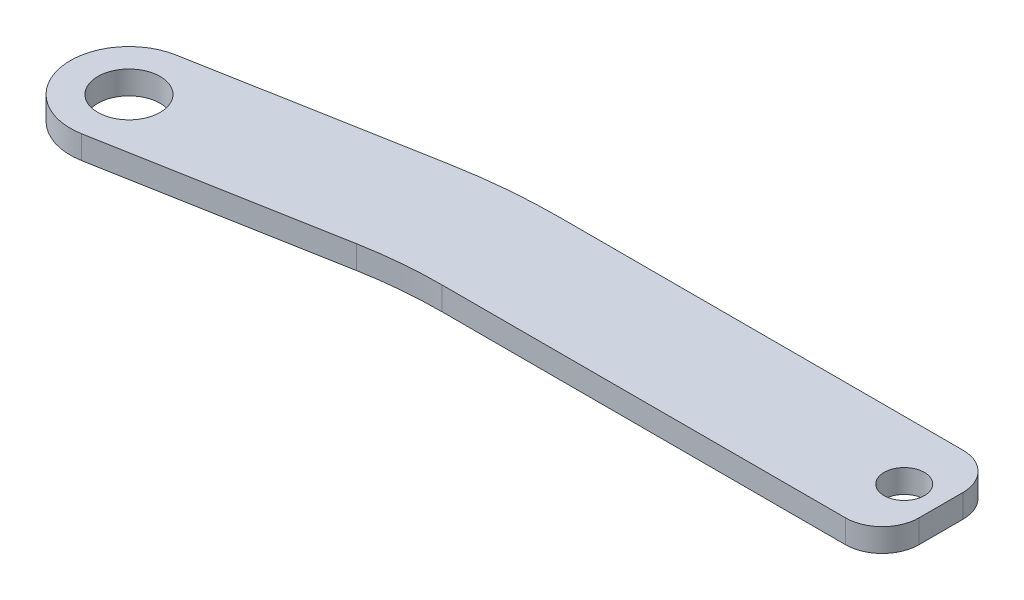
ISO-10303-21;
HEADER;
FILE_DESCRIPTION(('STEP AP214'),'2;1');
FILE_NAME('part.step','',(''),(''),'','','');
FILE_SCHEMA(('AUTOMOTIVE_DESIGN { 1 0 10303 214 1 1 1 1 }'));
ENDSEC;
DATA;
#1=APPLICATION_CONTEXT('core data for automotive mechanical design processes');
#2=APPLICATION_PROTOCOL_DEFINITION('international standard','automotive_design',2000,#1);
#3=PRODUCT_CONTEXT('',#1,'mechanical');
#4=PRODUCT('Part','Part','',(#3));
#5=PRODUCT_RELATED_PRODUCT_CATEGORY('part','',(#4));
#6=PRODUCT_DEFINITION_FORMATION('','',#4);
#7=PRODUCT_DEFINITION_CONTEXT('part definition',#1,'design');
#8=PRODUCT_DEFINITION('design','',#6,#7);
#9=PRODUCT_DEFINITION_SHAPE('','',#8);
#10=(LENGTH_UNIT() NAMED_UNIT(*) SI_UNIT(.MILLI.,.METRE.));
#11=(NAMED_UNIT(*) PLANE_ANGLE_UNIT() SI_UNIT($,.RADIAN.));
#12=(NAMED_UNIT(*) SI_UNIT($,.STERADIAN.) SOLID_ANGLE_UNIT());
#13=UNCERTAINTY_MEASURE_WITH_UNIT(LENGTH_MEASURE(1.E-05),#10,'distance_accuracy_value','');
#14=(GEOMETRIC_REPRESENTATION_CONTEXT(3) GLOBAL_UNCERTAINTY_ASSIGNED_CONTEXT((#13)) GLOBAL_UNIT_ASSIGNED_CONTEXT((#10,
#11,#12)) REPRESENTATION_CONTEXT('',''));
#15=CARTESIAN_POINT('',(0.,0.,0.));
#16=DIRECTION('',(0.,0.,1.));
#17=DIRECTION('',(1.,0.,0.));
#18=AXIS2_PLACEMENT_3D('',#15,#16,#17);
#19=CARTESIAN_POINT('',(0.,3.175,0.));
#20=DIRECTION('',(0.,-1.,0.));
#21=DIRECTION('',(0.,0.,-1.));
#22=AXIS2_PLACEMENT_3D('',#19,#20,#21);
#23=PLANE('',#22);
#24=CARTESIAN_POINT('',(0.,3.175,0.));
#25=DIRECTION('',(0.,1.,0.));
#26=DIRECTION('',(0.,0.,-1.));
#27=AXIS2_PLACEMENT_3D('',#24,#25,#26);
#28=CIRCLE('',#27,8.);
#29=CARTESIAN_POINT('',(-1.42865230605605,3.175,-7.87140092921207));
#30=VERTEX_POINT('',#29);
#31=CARTESIAN_POINT('',(1.42865230605605,3.175,7.87140092921207));
#32=VERTEX_POINT('',#31);
#33=EDGE_CURVE('E167',#30,#32,#28,.T.);
#34=ORIENTED_EDGE('',*,*,#33,.T.);
#35=DIRECTION('',(0.983925116151509,0.,-0.178581538257006));
#36=VECTOR('',#35,1.);
#37=CARTESIAN_POINT('',(33.14730770459,3.175,2.11449303090627));
#38=LINE('',#37,#36);
#39=CARTESIAN_POINT('',(33.14730770459,3.175,2.11449303090626));
#40=VERTEX_POINT('',#39);
#41=EDGE_CURVE('E105',#32,#40,#38,.T.);
#42=ORIENTED_EDGE('',*,*,#41,.T.);
#43=CARTESIAN_POINT('',(43.8622000000104,3.175,61.1499999999968));
#44=DIRECTION('',(0.,-1.,0.));
#45=DIRECTION('',(0.,0.,1.));
#46=AXIS2_PLACEMENT_3D('',#43,#44,#45);
#47=CIRCLE('',#46,60.);
#48=CARTESIAN_POINT('',(43.8622000000104,3.175,1.14999999999682));
#49=VERTEX_POINT('',#48);
#50=EDGE_CURVE('E188',#40,#49,#47,.T.);
#51=ORIENTED_EDGE('',*,*,#50,.T.);
#52=DIRECTION('',(1.,0.,0.));
#53=VECTOR('',#52,1.);
#54=CARTESIAN_POINT('',(98.8622000000104,3.175,1.14999999999682));
#55=LINE('',#54,#53);
#56=CARTESIAN_POINT('',(98.8622000000104,3.175,1.14999999999682));
#57=VERTEX_POINT('',#56);
#58=EDGE_CURVE('E207',#49,#57,#55,.T.);
#59=ORIENTED_EDGE('',*,*,#58,.T.);
#60=CARTESIAN_POINT('',(98.8622000000104,3.175,-3.85000000000318));
#61=DIRECTION('',(0.,1.,0.));
#62=DIRECTION('',(0.,0.,1.));
#63=AXIS2_PLACEMENT_3D('',#60,#61,#62);
#64=CIRCLE('',#63,5.);
#65=CARTESIAN_POINT('',(103.86220000001,3.175,-3.85000000000318));
#66=VERTEX_POINT('',#65);
#67=EDGE_CURVE('E204',#57,#66,#64,.T.);
#68=ORIENTED_EDGE('',*,*,#67,.T.);
#69=DIRECTION('',(0.,0.,-1.));
#70=VECTOR('',#69,1.);
#71=CARTESIAN_POINT('',(103.86220000001,3.175,-3.85000000000318));
#72=LINE('',#71,#70);
#73=CARTESIAN_POINT('',(103.86220000001,3.175,-9.85000000000319));
#74=VERTEX_POINT('',#73);
#75=EDGE_CURVE('E206',#66,#74,#72,.T.);
#76=ORIENTED_EDGE('',*,*,#75,.T.);
#77=CARTESIAN_POINT('',(98.8622000000104,3.175,-9.85000000000319));
#78=DIRECTION('',(0.,1.,0.));
#79=DIRECTION('',(0.,0.,1.));
#80=AXIS2_PLACEMENT_3D('',#77,#78,#79);
#81=CIRCLE('',#80,5.);
#82=CARTESIAN_POINT('',(98.8622000000104,3.175,-14.8500000000032));
#83=VERTEX_POINT('',#82);
#84=EDGE_CURVE('E130',#74,#83,#81,.T.);
#85=ORIENTED_EDGE('',*,*,#84,.T.);
#86=DIRECTION('',(-1.,0.,0.));
#87=VECTOR('',#86,1.);
#88=CARTESIAN_POINT('',(43.8622000000104,3.175,-14.8500000000032));
#89=LINE('',#88,#87);
#90=CARTESIAN_POINT('',(43.8622000000104,3.175,-14.8500000000032));
#91=VERTEX_POINT('',#90);
#92=EDGE_CURVE('E124',#83,#91,#89,.T.);
#93=ORIENTED_EDGE('',*,*,#92,.T.);
#94=CARTESIAN_POINT('',(43.8622000000104,3.175,61.1499999999968));
#95=DIRECTION('',(0.,1.,0.));
#96=DIRECTION('',(0.,0.,1.));
#97=AXIS2_PLACEMENT_3D('',#94,#95,#96);
#98=CIRCLE('',#97,76.);
#99=CARTESIAN_POINT('',(30.2900030924779,3.175,-13.6283088275179));
#100=VERTEX_POINT('',#99);
#101=EDGE_CURVE('E128',#91,#100,#98,.T.);
#102=ORIENTED_EDGE('',*,*,#101,.T.);
#103=DIRECTION('',(-0.98392511615151,0.,0.178581538257006));
#104=VECTOR('',#103,1.);
#105=CARTESIAN_POINT('',(-1.42865230605605,3.175,-7.87140092921207));
#106=LINE('',#105,#104);
#107=EDGE_CURVE('E56',#100,#30,#106,.T.);
#108=ORIENTED_EDGE('',*,*,#107,.T.);
#109=EDGE_LOOP('',(#34,#42,#51,#59,#68,#76,#85,#93,#102,#108));
#110=FACE_BOUND('',#109,.T.);
#111=CARTESIAN_POINT('',(0.,3.175,0.));
#112=DIRECTION('',(0.,1.,0.));
#113=DIRECTION('',(0.,0.,1.));
#114=AXIS2_PLACEMENT_3D('',#111,#112,#113);
#115=CIRCLE('',#114,4.25);
#116=CARTESIAN_POINT('',(0.,3.175,4.25));
#117=VERTEX_POINT('',#116);
#118=EDGE_CURVE('E152',#117,#117,#115,.T.);
#119=ORIENTED_EDGE('',*,*,#118,.F.);
#120=EDGE_LOOP('',(#119));
#121=FACE_BOUND('',#120,.T.);
#122=CARTESIAN_POINT('',(98.8622000000102,3.175,-6.85000000000274));
#123=DIRECTION('',(0.,1.,0.));
#124=DIRECTION('',(0.,0.,1.));
#125=AXIS2_PLACEMENT_3D('',#122,#123,#124);
#126=CIRCLE('',#125,2.75000000000001);
#127=CARTESIAN_POINT('',(98.8622000000102,3.175,-4.10000000000273));
#128=VERTEX_POINT('',#127);
#129=EDGE_CURVE('E218',#128,#128,#126,.T.);
#130=ORIENTED_EDGE('',*,*,#129,.F.);
#131=EDGE_LOOP('',(#130));
#132=FACE_BOUND('',#131,.T.);
#133=ADVANCED_FACE('F39',(#110,#121,#132),#23,.F.);
#134=CARTESIAN_POINT('',(0.,0.,0.));
#135=DIRECTION('',(0.,-1.,0.));
#136=DIRECTION('',(0.,0.,-1.));
#137=AXIS2_PLACEMENT_3D('',#134,#135,#136);
#138=PLANE('',#137);
#139=CARTESIAN_POINT('',(0.,0.,0.));
#140=DIRECTION('',(0.,1.,0.));
#141=DIRECTION('',(0.,0.,1.));
#142=AXIS2_PLACEMENT_3D('',#139,#140,#141);
#143=CIRCLE('',#142,4.25);
#144=CARTESIAN_POINT('',(0.,0.,4.25));
#145=VERTEX_POINT('',#144);
#146=EDGE_CURVE('E215',#145,#145,#143,.T.);
#147=ORIENTED_EDGE('',*,*,#146,.T.);
#148=EDGE_LOOP('',(#147));
#149=FACE_BOUND('',#148,.T.);
#150=CARTESIAN_POINT('',(0.,0.,0.));
#151=DIRECTION('',(0.,1.,0.));
#152=DIRECTION('',(0.,0.,-1.));
#153=AXIS2_PLACEMENT_3D('',#150,#151,#152);
#154=CIRCLE('',#153,8.);
#155=CARTESIAN_POINT('',(-1.42865230605605,0.,-7.87140092921207));
#156=VERTEX_POINT('',#155);
#157=CARTESIAN_POINT('',(1.42865230605605,0.,7.87140092921207));
#158=VERTEX_POINT('',#157);
#159=EDGE_CURVE('E148',#156,#158,#154,.T.);
#160=ORIENTED_EDGE('',*,*,#159,.F.);
#161=DIRECTION('',(-0.98392511615151,0.,0.178581538257006));
#162=VECTOR('',#161,1.);
#163=CARTESIAN_POINT('',(-1.42865230605605,0.,-7.87140092921207));
#164=LINE('',#163,#162);
#165=CARTESIAN_POINT('',(30.2900030924779,0.,-13.6283088275179));
#166=VERTEX_POINT('',#165);
#167=EDGE_CURVE('E97',#166,#156,#164,.T.);
#168=ORIENTED_EDGE('',*,*,#167,.F.);
#169=CARTESIAN_POINT('',(43.8622000000104,0.,61.1499999999968));
#170=DIRECTION('',(0.,1.,0.));
#171=DIRECTION('',(0.,0.,1.));
#172=AXIS2_PLACEMENT_3D('',#169,#170,#171);
#173=CIRCLE('',#172,76.);
#174=CARTESIAN_POINT('',(43.8622000000104,0.,-14.8500000000032));
#175=VERTEX_POINT('',#174);
#176=EDGE_CURVE('E91',#175,#166,#173,.T.);
#177=ORIENTED_EDGE('',*,*,#176,.F.);
#178=DIRECTION('',(-1.,0.,0.));
#179=VECTOR('',#178,1.);
#180=CARTESIAN_POINT('',(43.8622000000104,0.,-14.8500000000032));
#181=LINE('',#180,#179);
#182=CARTESIAN_POINT('',(98.8622000000104,0.,-14.8500000000032));
#183=VERTEX_POINT('',#182);
#184=EDGE_CURVE('E138',#183,#175,#181,.T.);
#185=ORIENTED_EDGE('',*,*,#184,.F.);
#186=CARTESIAN_POINT('',(98.8622000000104,0.,-9.85000000000319));
#187=DIRECTION('',(0.,1.,0.));
#188=DIRECTION('',(0.,0.,1.));
#189=AXIS2_PLACEMENT_3D('',#186,#187,#188);
#190=CIRCLE('',#189,5.);
#191=CARTESIAN_POINT('',(103.86220000001,0.,-9.85000000000319));
#192=VERTEX_POINT('',#191);
#193=EDGE_CURVE('E162',#192,#183,#190,.T.);
#194=ORIENTED_EDGE('',*,*,#193,.F.);
#195=DIRECTION('',(0.,0.,-1.));
#196=VECTOR('',#195,1.);
#197=CARTESIAN_POINT('',(103.86220000001,0.,-3.85000000000318));
#198=LINE('',#197,#196);
#199=CARTESIAN_POINT('',(103.86220000001,0.,-3.85000000000318));
#200=VERTEX_POINT('',#199);
#201=EDGE_CURVE('E160',#200,#192,#198,.T.);
#202=ORIENTED_EDGE('',*,*,#201,.F.);
#203=CARTESIAN_POINT('',(98.8622000000104,0.,-3.85000000000318));
#204=DIRECTION('',(0.,1.,0.));
#205=DIRECTION('',(0.,0.,1.));
#206=AXIS2_PLACEMENT_3D('',#203,#204,#205);
#207=CIRCLE('',#206,5.);
#208=CARTESIAN_POINT('',(98.8622000000104,0.,1.14999999999682));
#209=VERTEX_POINT('',#208);
#210=EDGE_CURVE('E158',#209,#200,#207,.T.);
#211=ORIENTED_EDGE('',*,*,#210,.F.);
#212=DIRECTION('',(1.,0.,0.));
#213=VECTOR('',#212,1.);
#214=CARTESIAN_POINT('',(98.8622000000104,0.,1.14999999999682));
#215=LINE('',#214,#213);
#216=CARTESIAN_POINT('',(43.8622000000104,0.,1.14999999999682));
#217=VERTEX_POINT('',#216);
#218=EDGE_CURVE('E156',#217,#209,#215,.T.);
#219=ORIENTED_EDGE('',*,*,#218,.F.);
#220=CARTESIAN_POINT('',(43.8622000000104,0.,61.1499999999968));
#221=DIRECTION('',(0.,-1.,0.));
#222=DIRECTION('',(0.,0.,1.));
#223=AXIS2_PLACEMENT_3D('',#220,#221,#222);
#224=CIRCLE('',#223,60.);
#225=CARTESIAN_POINT('',(33.14730770459,0.,2.11449303090626));
#226=VERTEX_POINT('',#225);
#227=EDGE_CURVE('E154',#226,#217,#224,.T.);
#228=ORIENTED_EDGE('',*,*,#227,.F.);
#229=DIRECTION('',(0.983925116151509,0.,-0.178581538257006));
#230=VECTOR('',#229,1.);
#231=CARTESIAN_POINT('',(33.14730770459,0.,2.11449303090627));
#232=LINE('',#231,#230);
#233=EDGE_CURVE('E151',#158,#226,#232,.T.);
#234=ORIENTED_EDGE('',*,*,#233,.F.);
#235=EDGE_LOOP('',(#160,#168,#177,#185,#194,#202,#211,#219,#228,#234));
#236=FACE_BOUND('',#235,.T.);
#237=CARTESIAN_POINT('',(98.8622000000102,0.,-6.85000000000274));
#238=DIRECTION('',(0.,1.,0.));
#239=DIRECTION('',(0.,0.,1.));
#240=AXIS2_PLACEMENT_3D('',#237,#238,#239);
#241=CIRCLE('',#240,2.75000000000001);
#242=CARTESIAN_POINT('',(98.8622000000102,0.,-4.10000000000273));
#243=VERTEX_POINT('',#242);
#244=EDGE_CURVE('E221',#243,#243,#241,.T.);
#245=ORIENTED_EDGE('',*,*,#244,.T.);
#246=EDGE_LOOP('',(#245));
#247=FACE_BOUND('',#246,.T.);
#248=ADVANCED_FACE('F192',(#149,#236,#247),#138,.T.);
#249=CARTESIAN_POINT('',(0.,3.175,0.));
#250=DIRECTION('',(0.,-1.,0.));
#251=DIRECTION('',(0.,0.,-1.));
#252=AXIS2_PLACEMENT_3D('',#249,#250,#251);
#253=CYLINDRICAL_SURFACE('',#252,8.);
#254=ORIENTED_EDGE('',*,*,#159,.T.);
#255=DIRECTION('',(0.,-1.,0.));
#256=VECTOR('',#255,1.);
#257=CARTESIAN_POINT('',(1.42865230605605,3.175,7.87140092921207));
#258=LINE('',#257,#256);
#259=EDGE_CURVE('E11',#32,#158,#258,.T.);
#260=ORIENTED_EDGE('',*,*,#259,.F.);
#261=ORIENTED_EDGE('',*,*,#33,.F.);
#262=DIRECTION('',(0.,-1.,0.));
#263=VECTOR('',#262,1.);
#264=CARTESIAN_POINT('',(-1.42865230605605,3.175,-7.87140092921207));
#265=LINE('',#264,#263);
#266=EDGE_CURVE('E144',#30,#156,#265,.T.);
#267=ORIENTED_EDGE('',*,*,#266,.T.);
#268=EDGE_LOOP('',(#254,#260,#261,#267));
#269=FACE_BOUND('',#268,.T.);
#270=ADVANCED_FACE('F41',(#269),#253,.T.);
#271=CARTESIAN_POINT('',(33.14730770459,3.175,2.11449303090627));
#272=DIRECTION('',(-0.178581538257006,0.,-0.983925116151509));
#273=DIRECTION('',(-0.98392511615151,0.,0.178581538257006));
#274=AXIS2_PLACEMENT_3D('',#271,#272,#273);
#275=PLANE('',#274);
#276=ORIENTED_EDGE('',*,*,#233,.T.);
#277=DIRECTION('',(0.,-1.,0.));
#278=VECTOR('',#277,1.);
#279=CARTESIAN_POINT('',(33.14730770459,3.175,2.11449303090626));
#280=LINE('',#279,#278);
#281=EDGE_CURVE('E48',#40,#226,#280,.T.);
#282=ORIENTED_EDGE('',*,*,#281,.F.);
#283=ORIENTED_EDGE('',*,*,#41,.F.);
#284=ORIENTED_EDGE('',*,*,#259,.T.);
#285=EDGE_LOOP('',(#276,#282,#283,#284));
#286=FACE_BOUND('',#285,.T.);
#287=ADVANCED_FACE('F261',(#286),#275,.F.);
#288=CARTESIAN_POINT('',(43.8622000000104,3.175,61.1499999999968));
#289=DIRECTION('',(0.,-1.,0.));
#290=DIRECTION('',(0.,0.,-1.));
#291=AXIS2_PLACEMENT_3D('',#288,#289,#290);
#292=CYLINDRICAL_SURFACE('',#291,60.);
#293=ORIENTED_EDGE('',*,*,#227,.T.);
#294=DIRECTION('',(0.,-1.,0.));
#295=VECTOR('',#294,1.);
#296=CARTESIAN_POINT('',(43.8622000000104,3.175,1.14999999999682));
#297=LINE('',#296,#295);
#298=EDGE_CURVE('E180',#49,#217,#297,.T.);
#299=ORIENTED_EDGE('',*,*,#298,.F.);
#300=ORIENTED_EDGE('',*,*,#50,.F.);
#301=ORIENTED_EDGE('',*,*,#281,.T.);
#302=EDGE_LOOP('',(#293,#299,#300,#301));
#303=FACE_BOUND('',#302,.T.);
#304=ADVANCED_FACE('F186',(#303),#292,.F.);
#305=CARTESIAN_POINT('',(98.8622000000104,3.175,1.14999999999682));
#306=DIRECTION('',(0.,0.,-1.));
#307=DIRECTION('',(-1.,0.,0.));
#308=AXIS2_PLACEMENT_3D('',#305,#306,#307);
#309=PLANE('',#308);
#310=ORIENTED_EDGE('',*,*,#218,.T.);
#311=DIRECTION('',(0.,-1.,0.));
#312=VECTOR('',#311,1.);
#313=CARTESIAN_POINT('',(98.8622000000104,3.175,1.14999999999682));
#314=LINE('',#313,#312);
#315=EDGE_CURVE('E177',#57,#209,#314,.T.);
#316=ORIENTED_EDGE('',*,*,#315,.F.);
#317=ORIENTED_EDGE('',*,*,#58,.F.);
#318=ORIENTED_EDGE('',*,*,#298,.T.);
#319=EDGE_LOOP('',(#310,#316,#317,#318));
#320=FACE_BOUND('',#319,.T.);
#321=ADVANCED_FACE('F198',(#320),#309,.F.);
#322=CARTESIAN_POINT('',(98.8622000000104,3.175,-3.85000000000318));
#323=DIRECTION('',(0.,-1.,0.));
#324=DIRECTION('',(0.,0.,-1.));
#325=AXIS2_PLACEMENT_3D('',#322,#323,#324);
#326=CYLINDRICAL_SURFACE('',#325,5.);
#327=ORIENTED_EDGE('',*,*,#210,.T.);
#328=DIRECTION('',(0.,-1.,0.));
#329=VECTOR('',#328,1.);
#330=CARTESIAN_POINT('',(103.86220000001,3.175,-3.85000000000318));
#331=LINE('',#330,#329);
#332=EDGE_CURVE('E174',#66,#200,#331,.T.);
#333=ORIENTED_EDGE('',*,*,#332,.F.);
#334=ORIENTED_EDGE('',*,*,#67,.F.);
#335=ORIENTED_EDGE('',*,*,#315,.T.);
#336=EDGE_LOOP('',(#327,#333,#334,#335));
#337=FACE_BOUND('',#336,.T.);
#338=ADVANCED_FACE('F202',(#337),#326,.T.);
#339=CARTESIAN_POINT('',(103.86220000001,3.175,-3.85000000000318));
#340=DIRECTION('',(-1.,0.,0.));
#341=DIRECTION('',(0.,0.,1.));
#342=AXIS2_PLACEMENT_3D('',#339,#340,#341);
#343=PLANE('',#342);
#344=ORIENTED_EDGE('',*,*,#201,.T.);
#345=DIRECTION('',(0.,-1.,0.));
#346=VECTOR('',#345,1.);
#347=CARTESIAN_POINT('',(103.86220000001,3.175,-9.85000000000319));
#348=LINE('',#347,#346);
#349=EDGE_CURVE('E171',#74,#192,#348,.T.);
#350=ORIENTED_EDGE('',*,*,#349,.F.);
#351=ORIENTED_EDGE('',*,*,#75,.F.);
#352=ORIENTED_EDGE('',*,*,#332,.T.);
#353=EDGE_LOOP('',(#344,#350,#351,#352));
#354=FACE_BOUND('',#353,.T.);
#355=ADVANCED_FACE('F251',(#354),#343,.F.);
#356=CARTESIAN_POINT('',(98.8622000000104,3.175,-9.85000000000319));
#357=DIRECTION('',(0.,-1.,0.));
#358=DIRECTION('',(0.,0.,-1.));
#359=AXIS2_PLACEMENT_3D('',#356,#357,#358);
#360=CYLINDRICAL_SURFACE('',#359,5.);
#361=ORIENTED_EDGE('',*,*,#193,.T.);
#362=DIRECTION('',(0.,-1.,0.));
#363=VECTOR('',#362,1.);
#364=CARTESIAN_POINT('',(98.8622000000104,3.175,-14.8500000000032));
#365=LINE('',#364,#363);
#366=EDGE_CURVE('E139',#83,#183,#365,.T.);
#367=ORIENTED_EDGE('',*,*,#366,.F.);
#368=ORIENTED_EDGE('',*,*,#84,.F.);
#369=ORIENTED_EDGE('',*,*,#349,.T.);
#370=EDGE_LOOP('',(#361,#367,#368,#369));
#371=FACE_BOUND('',#370,.T.);
#372=ADVANCED_FACE('F248',(#371),#360,.T.);
#373=CARTESIAN_POINT('',(43.8622000000104,3.175,-14.8500000000032));
#374=DIRECTION('',(0.,0.,1.));
#375=DIRECTION('',(1.,0.,0.));
#376=AXIS2_PLACEMENT_3D('',#373,#374,#375);
#377=PLANE('',#376);
#378=ORIENTED_EDGE('',*,*,#184,.T.);
#379=DIRECTION('',(0.,-1.,0.));
#380=VECTOR('',#379,1.);
#381=CARTESIAN_POINT('',(43.8622000000104,3.175,-14.8500000000032));
#382=LINE('',#381,#380);
#383=EDGE_CURVE('E135',#91,#175,#382,.T.);
#384=ORIENTED_EDGE('',*,*,#383,.F.);
#385=ORIENTED_EDGE('',*,*,#92,.F.);
#386=ORIENTED_EDGE('',*,*,#366,.T.);
#387=EDGE_LOOP('',(#378,#384,#385,#386));
#388=FACE_BOUND('',#387,.T.);
#389=ADVANCED_FACE('F136',(#388),#377,.F.);
#390=CARTESIAN_POINT('',(43.8622000000104,3.175,61.1499999999968));
#391=DIRECTION('',(0.,-1.,0.));
#392=DIRECTION('',(0.,0.,-1.));
#393=AXIS2_PLACEMENT_3D('',#390,#391,#392);
#394=CYLINDRICAL_SURFACE('',#393,76.);
#395=ORIENTED_EDGE('',*,*,#176,.T.);
#396=DIRECTION('',(0.,-1.,0.));
#397=VECTOR('',#396,1.);
#398=CARTESIAN_POINT('',(30.2900030924779,3.175,-13.6283088275179));
#399=LINE('',#398,#397);
#400=EDGE_CURVE('E140',#100,#166,#399,.T.);
#401=ORIENTED_EDGE('',*,*,#400,.F.);
#402=ORIENTED_EDGE('',*,*,#101,.F.);
#403=ORIENTED_EDGE('',*,*,#383,.T.);
#404=EDGE_LOOP('',(#395,#401,#402,#403));
#405=FACE_BOUND('',#404,.T.);
#406=ADVANCED_FACE('F142',(#405),#394,.T.);
#407=CARTESIAN_POINT('',(-1.42865230605605,3.175,-7.87140092921207));
#408=DIRECTION('',(0.178581538257005,0.,0.98392511615151));
#409=DIRECTION('',(0.98392511615151,0.,-0.178581538257006));
#410=AXIS2_PLACEMENT_3D('',#407,#408,#409);
#411=PLANE('',#410);
#412=ORIENTED_EDGE('',*,*,#167,.T.);
#413=ORIENTED_EDGE('',*,*,#266,.F.);
#414=ORIENTED_EDGE('',*,*,#107,.F.);
#415=ORIENTED_EDGE('',*,*,#400,.T.);
#416=EDGE_LOOP('',(#412,#413,#414,#415));
#417=FACE_BOUND('',#416,.T.);
#418=ADVANCED_FACE('F241',(#417),#411,.F.);
#419=CARTESIAN_POINT('',(0.,3.175,0.));
#420=DIRECTION('',(0.,-1.,0.));
#421=DIRECTION('',(0.,0.,-1.));
#422=AXIS2_PLACEMENT_3D('',#419,#420,#421);
#423=CYLINDRICAL_SURFACE('',#422,4.25);
#424=ORIENTED_EDGE('',*,*,#118,.T.);
#425=EDGE_LOOP('',(#424));
#426=FACE_BOUND('',#425,.T.);
#427=ORIENTED_EDGE('',*,*,#146,.F.);
#428=EDGE_LOOP('',(#427));
#429=FACE_BOUND('',#428,.T.);
#430=ADVANCED_FACE('F238',(#426,#429),#423,.F.);
#431=CARTESIAN_POINT('',(98.8622000000102,3.175,-6.85000000000274));
#432=DIRECTION('',(0.,-1.,0.));
#433=DIRECTION('',(0.,0.,-1.));
#434=AXIS2_PLACEMENT_3D('',#431,#432,#433);
#435=CYLINDRICAL_SURFACE('',#434,2.75000000000001);
#436=ORIENTED_EDGE('',*,*,#129,.T.);
#437=EDGE_LOOP('',(#436));
#438=FACE_BOUND('',#437,.T.);
#439=ORIENTED_EDGE('',*,*,#244,.F.);
#440=EDGE_LOOP('',(#439));
#441=FACE_BOUND('',#440,.T.);
#442=ADVANCED_FACE('F227',(#438,#441),#435,.F.);
#443=CLOSED_SHELL('',(#133,#248,#270,#287,#304,#321,#338,#355,#372,#389,#406,#418,#430,#442));
#444=MANIFOLD_SOLID_BREP('B2',#443);
#445=ADVANCED_BREP_SHAPE_REPRESENTATION('',(#18,#444),#14);
#446=SHAPE_DEFINITION_REPRESENTATION(#9,#445);
ENDSEC;
END-ISO-10303-21;
